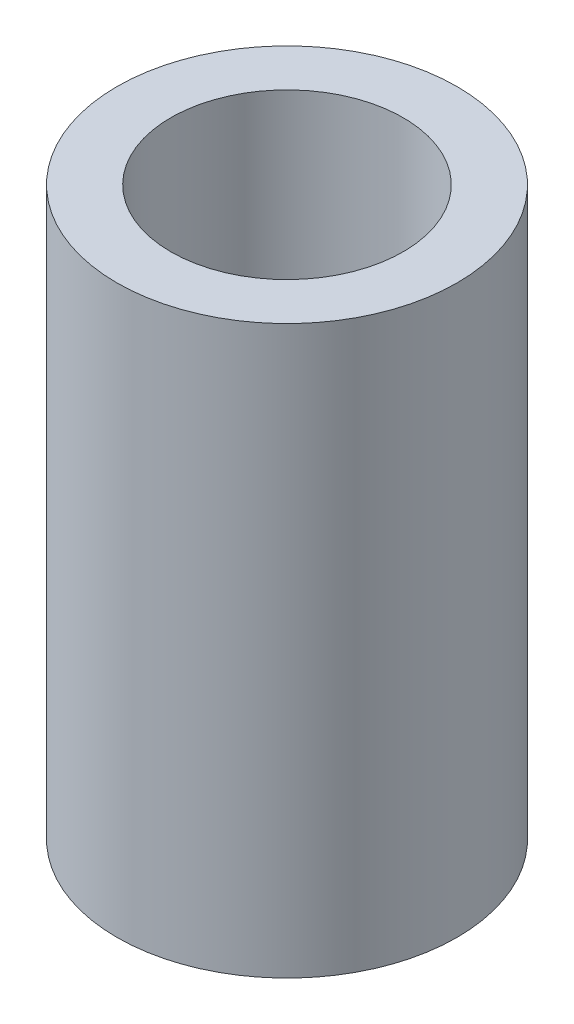
ISO-10303-21;
HEADER;
FILE_DESCRIPTION(('STEP AP214'),'2;1');
FILE_NAME('part.step','',(''),(''),'','','');
FILE_SCHEMA(('AUTOMOTIVE_DESIGN { 1 0 10303 214 1 1 1 1 }'));
ENDSEC;
DATA;
#1=APPLICATION_CONTEXT('core data for automotive mechanical design processes');
#2=APPLICATION_PROTOCOL_DEFINITION('international standard','automotive_design',2000,#1);
#3=PRODUCT_CONTEXT('',#1,'mechanical');
#4=PRODUCT('Part','Part','',(#3));
#5=PRODUCT_RELATED_PRODUCT_CATEGORY('part','',(#4));
#6=PRODUCT_DEFINITION_FORMATION('','',#4);
#7=PRODUCT_DEFINITION_CONTEXT('part definition',#1,'design');
#8=PRODUCT_DEFINITION('design','',#6,#7);
#9=PRODUCT_DEFINITION_SHAPE('','',#8);
#10=(LENGTH_UNIT() NAMED_UNIT(*) SI_UNIT(.MILLI.,.METRE.));
#11=(NAMED_UNIT(*) PLANE_ANGLE_UNIT() SI_UNIT($,.RADIAN.));
#12=(NAMED_UNIT(*) SI_UNIT($,.STERADIAN.) SOLID_ANGLE_UNIT());
#13=UNCERTAINTY_MEASURE_WITH_UNIT(LENGTH_MEASURE(1.E-05),#10,'distance_accuracy_value','');
#14=(GEOMETRIC_REPRESENTATION_CONTEXT(3) GLOBAL_UNCERTAINTY_ASSIGNED_CONTEXT((#13)) GLOBAL_UNIT_ASSIGNED_CONTEXT((#10,
#11,#12)) REPRESENTATION_CONTEXT('',''));
#15=CARTESIAN_POINT('',(0.,0.,0.));
#16=DIRECTION('',(0.,0.,1.));
#17=DIRECTION('',(1.,0.,0.));
#18=AXIS2_PLACEMENT_3D('',#15,#16,#17);
#19=CARTESIAN_POINT('',(300.,490.,157.));
#20=DIRECTION('',(0.,-1.,0.));
#21=DIRECTION('',(0.,0.,-1.));
#22=AXIS2_PLACEMENT_3D('',#19,#20,#21);
#23=CYLINDRICAL_SURFACE('',#22,5.99999999999999);
#24=CARTESIAN_POINT('',(300.,490.,157.));
#25=DIRECTION('',(0.,1.,0.));
#26=DIRECTION('',(0.,0.,1.));
#27=AXIS2_PLACEMENT_3D('',#24,#25,#26);
#28=CIRCLE('',#27,5.99999999999999);
#29=CARTESIAN_POINT('',(300.,490.,163.));
#30=VERTEX_POINT('',#29);
#31=EDGE_CURVE('E10',#30,#30,#28,.T.);
#32=ORIENTED_EDGE('',*,*,#31,.F.);
#33=EDGE_LOOP('',(#32));
#34=FACE_BOUND('',#33,.T.);
#35=CARTESIAN_POINT('',(300.,470.,157.));
#36=DIRECTION('',(0.,1.,0.));
#37=DIRECTION('',(0.,0.,1.));
#38=AXIS2_PLACEMENT_3D('',#35,#36,#37);
#39=CIRCLE('',#38,5.99999999999999);
#40=CARTESIAN_POINT('',(300.,470.,163.));
#41=VERTEX_POINT('',#40);
#42=EDGE_CURVE('E42',#41,#41,#39,.T.);
#43=ORIENTED_EDGE('',*,*,#42,.T.);
#44=EDGE_LOOP('',(#43));
#45=FACE_BOUND('',#44,.T.);
#46=ADVANCED_FACE('F40',(#34,#45),#23,.T.);
#47=CARTESIAN_POINT('',(300.,490.,157.));
#48=DIRECTION('',(0.,1.,0.));
#49=DIRECTION('',(0.,0.,1.));
#50=AXIS2_PLACEMENT_3D('',#47,#48,#49);
#51=PLANE('',#50);
#52=CARTESIAN_POINT('',(300.,490.,157.));
#53=DIRECTION('',(0.,1.,0.));
#54=DIRECTION('',(0.,0.,1.));
#55=AXIS2_PLACEMENT_3D('',#52,#53,#54);
#56=CIRCLE('',#55,4.09999999999998);
#57=CARTESIAN_POINT('',(300.,490.,161.1));
#58=VERTEX_POINT('',#57);
#59=EDGE_CURVE('E49',#58,#58,#56,.T.);
#60=ORIENTED_EDGE('',*,*,#59,.F.);
#61=EDGE_LOOP('',(#60));
#62=FACE_BOUND('',#61,.T.);
#63=ORIENTED_EDGE('',*,*,#31,.T.);
#64=EDGE_LOOP('',(#63));
#65=FACE_BOUND('',#64,.T.);
#66=ADVANCED_FACE('F67',(#62,#65),#51,.T.);
#67=CARTESIAN_POINT('',(300.,470.,157.));
#68=DIRECTION('',(0.,1.,0.));
#69=DIRECTION('',(0.,0.,1.));
#70=AXIS2_PLACEMENT_3D('',#67,#68,#69);
#71=PLANE('',#70);
#72=CARTESIAN_POINT('',(300.,470.,157.));
#73=DIRECTION('',(0.,1.,0.));
#74=DIRECTION('',(0.,0.,1.));
#75=AXIS2_PLACEMENT_3D('',#72,#73,#74);
#76=CIRCLE('',#75,4.09999999999998);
#77=CARTESIAN_POINT('',(300.,470.,161.1));
#78=VERTEX_POINT('',#77);
#79=EDGE_CURVE('E37',#78,#78,#76,.T.);
#80=ORIENTED_EDGE('',*,*,#79,.T.);
#81=EDGE_LOOP('',(#80));
#82=FACE_BOUND('',#81,.T.);
#83=ORIENTED_EDGE('',*,*,#42,.F.);
#84=EDGE_LOOP('',(#83));
#85=FACE_BOUND('',#84,.T.);
#86=ADVANCED_FACE('F60',(#82,#85),#71,.F.);
#87=CARTESIAN_POINT('',(300.,450.,157.));
#88=DIRECTION('',(0.,1.,0.));
#89=DIRECTION('',(0.,0.,1.));
#90=AXIS2_PLACEMENT_3D('',#87,#88,#89);
#91=CYLINDRICAL_SURFACE('',#90,4.09999999999998);
#92=CARTESIAN_POINT('',(300.,490.,161.1));
#93=CARTESIAN_POINT('',(300.,489.791666666667,161.1));
#94=CARTESIAN_POINT('',(300.,489.583333333333,161.1));
#95=CARTESIAN_POINT('',(300.,489.166666666667,161.1));
#96=CARTESIAN_POINT('',(300.,488.958333333333,161.1));
#97=CARTESIAN_POINT('',(300.,488.541666666667,161.1));
#98=CARTESIAN_POINT('',(300.,488.333333333333,161.1));
#99=CARTESIAN_POINT('',(300.,487.916666666667,161.1));
#100=CARTESIAN_POINT('',(300.,487.708333333333,161.1));
#101=CARTESIAN_POINT('',(300.,487.291666666667,161.1));
#102=CARTESIAN_POINT('',(300.,487.083333333333,161.1));
#103=CARTESIAN_POINT('',(300.,486.666666666667,161.1));
#104=CARTESIAN_POINT('',(300.,486.458333333333,161.1));
#105=CARTESIAN_POINT('',(300.,486.041666666667,161.1));
#106=CARTESIAN_POINT('',(300.,485.833333333333,161.1));
#107=CARTESIAN_POINT('',(300.,485.416666666667,161.1));
#108=CARTESIAN_POINT('',(300.,485.208333333333,161.1));
#109=CARTESIAN_POINT('',(300.,484.791666666667,161.1));
#110=CARTESIAN_POINT('',(300.,484.583333333333,161.1));
#111=CARTESIAN_POINT('',(300.,484.166666666667,161.1));
#112=CARTESIAN_POINT('',(300.,483.958333333333,161.1));
#113=CARTESIAN_POINT('',(300.,483.541666666667,161.1));
#114=CARTESIAN_POINT('',(300.,483.333333333333,161.1));
#115=CARTESIAN_POINT('',(300.,482.916666666667,161.1));
#116=CARTESIAN_POINT('',(300.,482.708333333333,161.1));
#117=CARTESIAN_POINT('',(300.,482.291666666667,161.1));
#118=CARTESIAN_POINT('',(300.,482.083333333333,161.1));
#119=CARTESIAN_POINT('',(300.,481.666666666667,161.1));
#120=CARTESIAN_POINT('',(300.,481.458333333333,161.1));
#121=CARTESIAN_POINT('',(300.,481.041666666667,161.1));
#122=CARTESIAN_POINT('',(300.,480.833333333333,161.1));
#123=CARTESIAN_POINT('',(300.,480.416666666667,161.1));
#124=CARTESIAN_POINT('',(300.,480.208333333333,161.1));
#125=CARTESIAN_POINT('',(300.,479.791666666667,161.1));
#126=CARTESIAN_POINT('',(300.,479.583333333333,161.1));
#127=CARTESIAN_POINT('',(300.,479.166666666667,161.1));
#128=CARTESIAN_POINT('',(300.,478.958333333333,161.1));
#129=CARTESIAN_POINT('',(300.,478.541666666667,161.1));
#130=CARTESIAN_POINT('',(300.,478.333333333333,161.1));
#131=CARTESIAN_POINT('',(300.,477.916666666667,161.1));
#132=CARTESIAN_POINT('',(300.,477.708333333333,161.1));
#133=CARTESIAN_POINT('',(300.,477.291666666667,161.1));
#134=CARTESIAN_POINT('',(300.,477.083333333333,161.1));
#135=CARTESIAN_POINT('',(300.,476.666666666667,161.1));
#136=CARTESIAN_POINT('',(300.,476.458333333333,161.1));
#137=CARTESIAN_POINT('',(300.,476.041666666667,161.1));
#138=CARTESIAN_POINT('',(300.,475.833333333333,161.1));
#139=CARTESIAN_POINT('',(300.,475.416666666667,161.1));
#140=CARTESIAN_POINT('',(300.,475.208333333333,161.1));
#141=CARTESIAN_POINT('',(300.,474.791666666667,161.1));
#142=CARTESIAN_POINT('',(300.,474.583333333333,161.1));
#143=CARTESIAN_POINT('',(300.,474.166666666667,161.1));
#144=CARTESIAN_POINT('',(300.,473.958333333333,161.1));
#145=CARTESIAN_POINT('',(300.,473.541666666667,161.1));
#146=CARTESIAN_POINT('',(300.,473.333333333333,161.1));
#147=CARTESIAN_POINT('',(300.,472.916666666667,161.1));
#148=CARTESIAN_POINT('',(300.,472.708333333333,161.1));
#149=CARTESIAN_POINT('',(300.,472.291666666667,161.1));
#150=CARTESIAN_POINT('',(300.,472.083333333333,161.1));
#151=CARTESIAN_POINT('',(300.,471.666666666667,161.1));
#152=CARTESIAN_POINT('',(300.,471.458333333333,161.1));
#153=CARTESIAN_POINT('',(300.,471.041666666667,161.1));
#154=CARTESIAN_POINT('',(300.,470.833333333333,161.1));
#155=CARTESIAN_POINT('',(300.,470.416666666667,161.1));
#156=CARTESIAN_POINT('',(300.,470.208333333333,161.1));
#157=CARTESIAN_POINT('',(300.,470.,161.1));
#158=B_SPLINE_CURVE_WITH_KNOTS('',3,(#92,#93,#94,#95,#96,#97,#98,#99,#100,#101,#102,#103,#104,
#105,#106,#107,#108,#109,#110,#111,#112,#113,#114,#115,#116,#117,#118,#119,#120,#121,#122,#123,
#124,#125,#126,#127,#128,#129,#130,#131,#132,#133,#134,#135,#136,#137,#138,#139,#140,#141,#142,
#143,#144,#145,#146,#147,#148,#149,#150,#151,#152,#153,#154,#155,#156,#157),.UNSPECIFIED.,.F.,
.F.,(4,2,2,2,2,2,2,2,2,2,2,2,2,2,2,2,2,2,2,2,2,2,2,2,2,2,2,2,2,2,2,2,4),(0.,0.624999999999987,
1.24999999999997,1.87499999999996,2.5,3.12499999999999,3.74999999999998,4.37499999999996,5.,
5.62499999999999,6.24999999999998,6.87499999999996,7.50000000000001,8.12499999999999,
8.74999999999998,9.37499999999997,10.,10.625,11.25,11.875,12.5,13.125,13.75,14.375,15.,15.625,
16.25,16.875,17.5,18.125,18.75,19.375,20.),.UNSPECIFIED.);
#159=EDGE_CURVE('BSEAM58',#58,#78,#158,.T.);
#160=ORIENTED_EDGE('',*,*,#59,.T.);
#161=ORIENTED_EDGE('',*,*,#79,.F.);
#162=ORIENTED_EDGE('',*,*,#159,.T.);
#163=ORIENTED_EDGE('',*,*,#159,.F.);
#164=EDGE_LOOP('',(#160,#162,#161,#163));
#165=FACE_BOUND('',#164,.T.);
#166=ADVANCED_FACE('F58',(#165),#91,.F.);
#167=CLOSED_SHELL('',(#46,#66,#86,#166));
#168=MANIFOLD_SOLID_BREP('B2',#167);
#169=ADVANCED_BREP_SHAPE_REPRESENTATION('',(#18,#168),#14);
#170=SHAPE_DEFINITION_REPRESENTATION(#9,#169);
ENDSEC;
END-ISO-10303-21;
